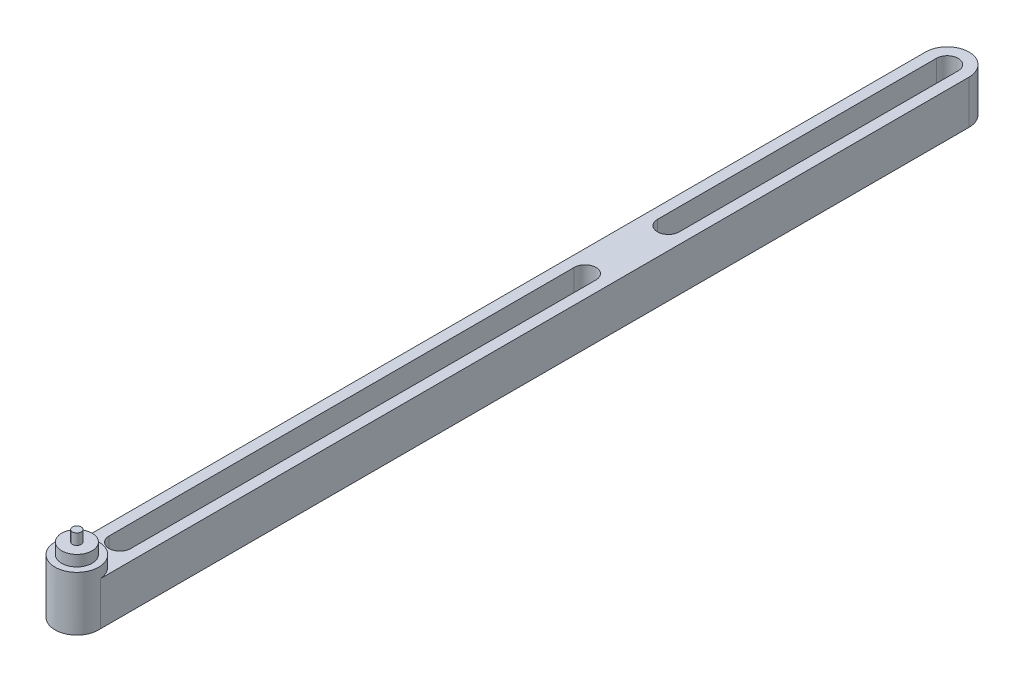
ISO-10303-21;
HEADER;
FILE_DESCRIPTION(('STEP AP214'),'2;1');
FILE_NAME('part.step','',(''),(''),'','','');
FILE_SCHEMA(('AUTOMOTIVE_DESIGN { 1 0 10303 214 1 1 1 1 }'));
ENDSEC;
DATA;
#1=APPLICATION_CONTEXT('core data for automotive mechanical design processes');
#2=APPLICATION_PROTOCOL_DEFINITION('international standard','automotive_design',2000,#1);
#3=PRODUCT_CONTEXT('',#1,'mechanical');
#4=PRODUCT('Part','Part','',(#3));
#5=PRODUCT_RELATED_PRODUCT_CATEGORY('part','',(#4));
#6=PRODUCT_DEFINITION_FORMATION('','',#4);
#7=PRODUCT_DEFINITION_CONTEXT('part definition',#1,'design');
#8=PRODUCT_DEFINITION('design','',#6,#7);
#9=PRODUCT_DEFINITION_SHAPE('','',#8);
#10=(LENGTH_UNIT() NAMED_UNIT(*) SI_UNIT(.MILLI.,.METRE.));
#11=(NAMED_UNIT(*) PLANE_ANGLE_UNIT() SI_UNIT($,.RADIAN.));
#12=(NAMED_UNIT(*) SI_UNIT($,.STERADIAN.) SOLID_ANGLE_UNIT());
#13=UNCERTAINTY_MEASURE_WITH_UNIT(LENGTH_MEASURE(1.E-05),#10,'distance_accuracy_value','');
#14=(GEOMETRIC_REPRESENTATION_CONTEXT(3) GLOBAL_UNCERTAINTY_ASSIGNED_CONTEXT((#13)) GLOBAL_UNIT_ASSIGNED_CONTEXT((#10,
#11,#12)) REPRESENTATION_CONTEXT('',''));
#15=CARTESIAN_POINT('',(0.,0.,0.));
#16=DIRECTION('',(0.,0.,1.));
#17=DIRECTION('',(1.,0.,0.));
#18=AXIS2_PLACEMENT_3D('',#15,#16,#17);
#19=CARTESIAN_POINT('',(0.,10.,143.903897259946));
#20=DIRECTION('',(0.,-1.,0.));
#21=DIRECTION('',(0.,0.,-1.));
#22=AXIS2_PLACEMENT_3D('',#19,#20,#21);
#23=CYLINDRICAL_SURFACE('',#22,2.5);
#24=CARTESIAN_POINT('',(0.,0.,143.903897259946));
#25=DIRECTION('',(0.,1.,0.));
#26=DIRECTION('',(0.,0.,1.));
#27=AXIS2_PLACEMENT_3D('',#24,#25,#26);
#28=CIRCLE('',#27,2.5);
#29=CARTESIAN_POINT('',(-2.49999999999999,0.,143.903897259946));
#30=VERTEX_POINT('',#29);
#31=CARTESIAN_POINT('',(2.50000000000001,0.,143.903897259946));
#32=VERTEX_POINT('',#31);
#33=EDGE_CURVE('E192',#30,#32,#28,.T.);
#34=ORIENTED_EDGE('',*,*,#33,.F.);
#35=DIRECTION('',(0.,-1.,0.));
#36=VECTOR('',#35,1.);
#37=CARTESIAN_POINT('',(-2.49999999999999,10.,143.903897259946));
#38=LINE('',#37,#36);
#39=CARTESIAN_POINT('',(-2.49999999999999,10.,143.903897259946));
#40=VERTEX_POINT('',#39);
#41=EDGE_CURVE('E148',#40,#30,#38,.T.);
#42=ORIENTED_EDGE('',*,*,#41,.F.);
#43=CARTESIAN_POINT('',(0.,10.,143.903897259946));
#44=DIRECTION('',(0.,1.,0.));
#45=DIRECTION('',(0.,0.,1.));
#46=AXIS2_PLACEMENT_3D('',#43,#44,#45);
#47=CIRCLE('',#46,2.5);
#48=CARTESIAN_POINT('',(2.50000000000001,10.,143.903897259946));
#49=VERTEX_POINT('',#48);
#50=EDGE_CURVE('E152',#40,#49,#47,.T.);
#51=ORIENTED_EDGE('',*,*,#50,.T.);
#52=DIRECTION('',(0.,-1.,0.));
#53=VECTOR('',#52,1.);
#54=CARTESIAN_POINT('',(2.50000000000001,10.,143.903897259946));
#55=LINE('',#54,#53);
#56=EDGE_CURVE('E106',#49,#32,#55,.T.);
#57=ORIENTED_EDGE('',*,*,#56,.T.);
#58=EDGE_LOOP('',(#34,#42,#51,#57));
#59=FACE_BOUND('',#58,.T.);
#60=ADVANCED_FACE('F41',(#59),#23,.F.);
#61=CARTESIAN_POINT('',(-2.5,10.,0.));
#62=DIRECTION('',(1.,0.,0.));
#63=DIRECTION('',(0.,0.,-1.));
#64=AXIS2_PLACEMENT_3D('',#61,#62,#63);
#65=PLANE('',#64);
#66=DIRECTION('',(0.,0.,1.));
#67=VECTOR('',#66,1.);
#68=CARTESIAN_POINT('',(-2.5,0.,0.));
#69=LINE('',#68,#67);
#70=CARTESIAN_POINT('',(-2.5,0.,37.0144054426046));
#71=VERTEX_POINT('',#70);
#72=EDGE_CURVE('E142',#71,#30,#69,.T.);
#73=ORIENTED_EDGE('',*,*,#72,.F.);
#74=DIRECTION('',(0.,-1.,0.));
#75=VECTOR('',#74,1.);
#76=CARTESIAN_POINT('',(-2.5,10.,37.0144054426046));
#77=LINE('',#76,#75);
#78=CARTESIAN_POINT('',(-2.5,10.,37.0144054426046));
#79=VERTEX_POINT('',#78);
#80=EDGE_CURVE('E137',#79,#71,#77,.T.);
#81=ORIENTED_EDGE('',*,*,#80,.F.);
#82=DIRECTION('',(0.,0.,1.));
#83=VECTOR('',#82,1.);
#84=CARTESIAN_POINT('',(-2.5,10.,0.));
#85=LINE('',#84,#83);
#86=EDGE_CURVE('E140',#79,#40,#85,.T.);
#87=ORIENTED_EDGE('',*,*,#86,.T.);
#88=ORIENTED_EDGE('',*,*,#41,.T.);
#89=EDGE_LOOP('',(#73,#81,#87,#88));
#90=FACE_BOUND('',#89,.T.);
#91=ADVANCED_FACE('F139',(#90),#65,.T.);
#92=CARTESIAN_POINT('',(0.,10.,37.0144054426046));
#93=DIRECTION('',(0.,-1.,0.));
#94=DIRECTION('',(0.,0.,-1.));
#95=AXIS2_PLACEMENT_3D('',#92,#93,#94);
#96=CYLINDRICAL_SURFACE('',#95,2.5);
#97=CARTESIAN_POINT('',(0.,0.,37.0144054426046));
#98=DIRECTION('',(0.,1.,0.));
#99=DIRECTION('',(0.,0.,1.));
#100=AXIS2_PLACEMENT_3D('',#97,#98,#99);
#101=CIRCLE('',#100,2.5);
#102=CARTESIAN_POINT('',(2.5,0.,37.0144054426046));
#103=VERTEX_POINT('',#102);
#104=EDGE_CURVE('E198',#103,#71,#101,.T.);
#105=ORIENTED_EDGE('',*,*,#104,.F.);
#106=DIRECTION('',(0.,-1.,0.));
#107=VECTOR('',#106,1.);
#108=CARTESIAN_POINT('',(2.5,10.,37.0144054426046));
#109=LINE('',#108,#107);
#110=CARTESIAN_POINT('',(2.5,10.,37.0144054426046));
#111=VERTEX_POINT('',#110);
#112=EDGE_CURVE('E99',#111,#103,#109,.T.);
#113=ORIENTED_EDGE('',*,*,#112,.F.);
#114=CARTESIAN_POINT('',(0.,10.,37.0144054426046));
#115=DIRECTION('',(0.,1.,0.));
#116=DIRECTION('',(0.,0.,1.));
#117=AXIS2_PLACEMENT_3D('',#114,#115,#116);
#118=CIRCLE('',#117,2.5);
#119=EDGE_CURVE('E151',#111,#79,#118,.T.);
#120=ORIENTED_EDGE('',*,*,#119,.T.);
#121=ORIENTED_EDGE('',*,*,#80,.T.);
#122=EDGE_LOOP('',(#105,#113,#120,#121));
#123=FACE_BOUND('',#122,.T.);
#124=ADVANCED_FACE('F155',(#123),#96,.F.);
#125=CARTESIAN_POINT('',(0.,10.,17.887410680907));
#126=DIRECTION('',(0.,-1.,0.));
#127=DIRECTION('',(0.,0.,-1.));
#128=AXIS2_PLACEMENT_3D('',#125,#126,#127);
#129=CYLINDRICAL_SURFACE('',#128,2.5);
#130=CARTESIAN_POINT('',(0.,0.,17.887410680907));
#131=DIRECTION('',(0.,1.,0.));
#132=DIRECTION('',(0.,0.,1.));
#133=AXIS2_PLACEMENT_3D('',#130,#131,#132);
#134=CIRCLE('',#133,2.5);
#135=CARTESIAN_POINT('',(-2.49999999999999,0.,17.887410680907));
#136=VERTEX_POINT('',#135);
#137=CARTESIAN_POINT('',(2.50000000000001,0.,17.887410680907));
#138=VERTEX_POINT('',#137);
#139=EDGE_CURVE('E176',#136,#138,#134,.T.);
#140=ORIENTED_EDGE('',*,*,#139,.F.);
#141=DIRECTION('',(0.,-1.,0.));
#142=VECTOR('',#141,1.);
#143=CARTESIAN_POINT('',(-2.49999999999999,10.,17.887410680907));
#144=LINE('',#143,#142);
#145=CARTESIAN_POINT('',(-2.49999999999999,10.,17.887410680907));
#146=VERTEX_POINT('',#145);
#147=EDGE_CURVE('E207',#146,#136,#144,.T.);
#148=ORIENTED_EDGE('',*,*,#147,.F.);
#149=CARTESIAN_POINT('',(0.,10.,17.887410680907));
#150=DIRECTION('',(0.,1.,0.));
#151=DIRECTION('',(0.,0.,1.));
#152=AXIS2_PLACEMENT_3D('',#149,#150,#151);
#153=CIRCLE('',#152,2.5);
#154=CARTESIAN_POINT('',(2.50000000000001,10.,17.887410680907));
#155=VERTEX_POINT('',#154);
#156=EDGE_CURVE('E272',#146,#155,#153,.T.);
#157=ORIENTED_EDGE('',*,*,#156,.T.);
#158=DIRECTION('',(0.,-1.,0.));
#159=VECTOR('',#158,1.);
#160=CARTESIAN_POINT('',(2.50000000000001,10.,17.887410680907));
#161=LINE('',#160,#159);
#162=EDGE_CURVE('E212',#155,#138,#161,.T.);
#163=ORIENTED_EDGE('',*,*,#162,.T.);
#164=EDGE_LOOP('',(#140,#148,#157,#163));
#165=FACE_BOUND('',#164,.T.);
#166=ADVANCED_FACE('F320',(#165),#129,.F.);
#167=CARTESIAN_POINT('',(-2.49999999999999,10.,0.));
#168=DIRECTION('',(1.,0.,0.));
#169=DIRECTION('',(0.,0.,-1.));
#170=AXIS2_PLACEMENT_3D('',#167,#168,#169);
#171=PLANE('',#170);
#172=DIRECTION('',(0.,0.,1.));
#173=VECTOR('',#172,1.);
#174=CARTESIAN_POINT('',(-2.49999999999999,0.,0.));
#175=LINE('',#174,#173);
#176=CARTESIAN_POINT('',(-2.5,0.,-46.2037037037037));
#177=VERTEX_POINT('',#176);
#178=EDGE_CURVE('E180',#177,#136,#175,.T.);
#179=ORIENTED_EDGE('',*,*,#178,.F.);
#180=DIRECTION('',(0.,-1.,0.));
#181=VECTOR('',#180,1.);
#182=CARTESIAN_POINT('',(-2.5,10.,-46.2037037037037));
#183=LINE('',#182,#181);
#184=CARTESIAN_POINT('',(-2.5,10.,-46.2037037037037));
#185=VERTEX_POINT('',#184);
#186=EDGE_CURVE('E218',#185,#177,#183,.T.);
#187=ORIENTED_EDGE('',*,*,#186,.F.);
#188=DIRECTION('',(0.,0.,1.));
#189=VECTOR('',#188,1.);
#190=CARTESIAN_POINT('',(-2.49999999999999,10.,0.));
#191=LINE('',#190,#189);
#192=EDGE_CURVE('E276',#185,#146,#191,.T.);
#193=ORIENTED_EDGE('',*,*,#192,.T.);
#194=ORIENTED_EDGE('',*,*,#147,.T.);
#195=EDGE_LOOP('',(#179,#187,#193,#194));
#196=FACE_BOUND('',#195,.T.);
#197=ADVANCED_FACE('F316',(#196),#171,.T.);
#198=CARTESIAN_POINT('',(0.,10.,-46.2037037037037));
#199=DIRECTION('',(0.,-1.,0.));
#200=DIRECTION('',(0.,0.,-1.));
#201=AXIS2_PLACEMENT_3D('',#198,#199,#200);
#202=CYLINDRICAL_SURFACE('',#201,2.5);
#203=CARTESIAN_POINT('',(0.,0.,-46.2037037037037));
#204=DIRECTION('',(0.,1.,0.));
#205=DIRECTION('',(0.,0.,1.));
#206=AXIS2_PLACEMENT_3D('',#203,#204,#205);
#207=CIRCLE('',#206,2.5);
#208=CARTESIAN_POINT('',(2.5,0.,-46.2037037037037));
#209=VERTEX_POINT('',#208);
#210=EDGE_CURVE('E184',#209,#177,#207,.T.);
#211=ORIENTED_EDGE('',*,*,#210,.F.);
#212=DIRECTION('',(0.,-1.,0.));
#213=VECTOR('',#212,1.);
#214=CARTESIAN_POINT('',(2.5,10.,-46.2037037037037));
#215=LINE('',#214,#213);
#216=CARTESIAN_POINT('',(2.5,10.,-46.2037037037037));
#217=VERTEX_POINT('',#216);
#218=EDGE_CURVE('E215',#217,#209,#215,.T.);
#219=ORIENTED_EDGE('',*,*,#218,.F.);
#220=CARTESIAN_POINT('',(0.,10.,-46.2037037037037));
#221=DIRECTION('',(0.,1.,0.));
#222=DIRECTION('',(0.,0.,1.));
#223=AXIS2_PLACEMENT_3D('',#220,#221,#222);
#224=CIRCLE('',#223,2.5);
#225=EDGE_CURVE('E280',#217,#185,#224,.T.);
#226=ORIENTED_EDGE('',*,*,#225,.T.);
#227=ORIENTED_EDGE('',*,*,#186,.T.);
#228=EDGE_LOOP('',(#211,#219,#226,#227));
#229=FACE_BOUND('',#228,.T.);
#230=ADVANCED_FACE('F313',(#229),#202,.F.);
#231=CARTESIAN_POINT('',(0.,10.,-46.2037037037037));
#232=DIRECTION('',(0.,-1.,0.));
#233=DIRECTION('',(0.,0.,-1.));
#234=AXIS2_PLACEMENT_3D('',#231,#232,#233);
#235=CYLINDRICAL_SURFACE('',#234,5.);
#236=CARTESIAN_POINT('',(0.,0.,-46.2037037037037));
#237=DIRECTION('',(0.,1.,0.));
#238=DIRECTION('',(0.,0.,1.));
#239=AXIS2_PLACEMENT_3D('',#236,#237,#238);
#240=CIRCLE('',#239,5.);
#241=CARTESIAN_POINT('',(-5.,0.,-46.2037037037037));
#242=VERTEX_POINT('',#241);
#243=CARTESIAN_POINT('',(5.,0.,-46.2037037037037));
#244=VERTEX_POINT('',#243);
#245=EDGE_CURVE('E163',#242,#244,#240,.F.);
#246=ORIENTED_EDGE('',*,*,#245,.F.);
#247=DIRECTION('',(0.,-1.,0.));
#248=VECTOR('',#247,1.);
#249=CARTESIAN_POINT('',(-5.,10.,-46.2037037037037));
#250=LINE('',#249,#248);
#251=CARTESIAN_POINT('',(-5.,10.,-46.2037037037037));
#252=VERTEX_POINT('',#251);
#253=EDGE_CURVE('E45',#252,#242,#250,.T.);
#254=ORIENTED_EDGE('',*,*,#253,.F.);
#255=CARTESIAN_POINT('',(0.,10.,-46.2037037037037));
#256=DIRECTION('',(0.,1.,0.));
#257=DIRECTION('',(0.,0.,1.));
#258=AXIS2_PLACEMENT_3D('',#255,#256,#257);
#259=CIRCLE('',#258,5.);
#260=CARTESIAN_POINT('',(5.,10.,-46.2037037037037));
#261=VERTEX_POINT('',#260);
#262=EDGE_CURVE('E204',#252,#261,#259,.F.);
#263=ORIENTED_EDGE('',*,*,#262,.T.);
#264=DIRECTION('',(0.,-1.,0.));
#265=VECTOR('',#264,1.);
#266=CARTESIAN_POINT('',(5.,10.,-46.2037037037037));
#267=LINE('',#266,#265);
#268=EDGE_CURVE('E159',#261,#244,#267,.T.);
#269=ORIENTED_EDGE('',*,*,#268,.T.);
#270=EDGE_LOOP('',(#246,#254,#263,#269));
#271=FACE_BOUND('',#270,.T.);
#272=ADVANCED_FACE('F43',(#271),#235,.T.);
#273=CARTESIAN_POINT('',(-5.,10.,0.));
#274=DIRECTION('',(-1.,0.,0.));
#275=DIRECTION('',(0.,0.,1.));
#276=AXIS2_PLACEMENT_3D('',#273,#274,#275);
#277=PLANE('',#276);
#278=DIRECTION('',(0.,0.,-1.));
#279=VECTOR('',#278,1.);
#280=CARTESIAN_POINT('',(-5.,0.,0.));
#281=LINE('',#280,#279);
#282=CARTESIAN_POINT('',(-5.,0.,153.415497966942));
#283=VERTEX_POINT('',#282);
#284=EDGE_CURVE('E167',#283,#242,#281,.T.);
#285=ORIENTED_EDGE('',*,*,#284,.F.);
#286=DIRECTION('',(0.,-1.,0.));
#287=VECTOR('',#286,1.);
#288=CARTESIAN_POINT('',(-5.,10.,153.415497966942));
#289=LINE('',#288,#287);
#290=CARTESIAN_POINT('',(-5.,10.,153.415497966942));
#291=VERTEX_POINT('',#290);
#292=EDGE_CURVE('E228',#291,#283,#289,.T.);
#293=ORIENTED_EDGE('',*,*,#292,.F.);
#294=DIRECTION('',(0.,0.,-1.));
#295=VECTOR('',#294,1.);
#296=CARTESIAN_POINT('',(-5.,10.,0.));
#297=LINE('',#296,#295);
#298=EDGE_CURVE('E241',#291,#252,#297,.T.);
#299=ORIENTED_EDGE('',*,*,#298,.T.);
#300=ORIENTED_EDGE('',*,*,#253,.T.);
#301=EDGE_LOOP('',(#285,#293,#299,#300));
#302=FACE_BOUND('',#301,.T.);
#303=ADVANCED_FACE('F239',(#302),#277,.T.);
#304=CARTESIAN_POINT('',(2.50000000000001,10.,0.));
#305=DIRECTION('',(1.,0.,0.));
#306=DIRECTION('',(0.,0.,-1.));
#307=AXIS2_PLACEMENT_3D('',#304,#305,#306);
#308=PLANE('',#307);
#309=DIRECTION('',(0.,0.,1.));
#310=VECTOR('',#309,1.);
#311=CARTESIAN_POINT('',(2.50000000000001,0.,0.));
#312=LINE('',#311,#310);
#313=EDGE_CURVE('E188',#209,#138,#312,.T.);
#314=ORIENTED_EDGE('',*,*,#313,.T.);
#315=ORIENTED_EDGE('',*,*,#162,.F.);
#316=DIRECTION('',(0.,0.,1.));
#317=VECTOR('',#316,1.);
#318=CARTESIAN_POINT('',(2.50000000000001,10.,0.));
#319=LINE('',#318,#317);
#320=EDGE_CURVE('E284',#217,#155,#319,.T.);
#321=ORIENTED_EDGE('',*,*,#320,.F.);
#322=ORIENTED_EDGE('',*,*,#218,.T.);
#323=EDGE_LOOP('',(#314,#315,#321,#322));
#324=FACE_BOUND('',#323,.T.);
#325=ADVANCED_FACE('F298',(#324),#308,.F.);
#326=CARTESIAN_POINT('',(5.,10.,0.));
#327=DIRECTION('',(-1.,0.,0.));
#328=DIRECTION('',(0.,0.,1.));
#329=AXIS2_PLACEMENT_3D('',#326,#327,#328);
#330=PLANE('',#329);
#331=DIRECTION('',(0.,0.,-1.));
#332=VECTOR('',#331,1.);
#333=CARTESIAN_POINT('',(5.,0.,0.));
#334=LINE('',#333,#332);
#335=CARTESIAN_POINT('',(5.,0.,153.415497966942));
#336=VERTEX_POINT('',#335);
#337=EDGE_CURVE('E172',#336,#244,#334,.T.);
#338=ORIENTED_EDGE('',*,*,#337,.T.);
#339=ORIENTED_EDGE('',*,*,#268,.F.);
#340=DIRECTION('',(0.,0.,-1.));
#341=VECTOR('',#340,1.);
#342=CARTESIAN_POINT('',(5.,10.,0.));
#343=LINE('',#342,#341);
#344=CARTESIAN_POINT('',(5.,10.,153.415497966942));
#345=VERTEX_POINT('',#344);
#346=EDGE_CURVE('E269',#345,#261,#343,.T.);
#347=ORIENTED_EDGE('',*,*,#346,.F.);
#348=DIRECTION('',(0.,-1.,0.));
#349=VECTOR('',#348,1.);
#350=CARTESIAN_POINT('',(5.,10.,153.415497966942));
#351=LINE('',#350,#349);
#352=EDGE_CURVE('E225',#345,#336,#351,.T.);
#353=ORIENTED_EDGE('',*,*,#352,.T.);
#354=EDGE_LOOP('',(#338,#339,#347,#353));
#355=FACE_BOUND('',#354,.T.);
#356=ADVANCED_FACE('F290',(#355),#330,.F.);
#357=CARTESIAN_POINT('',(2.5,10.,0.));
#358=DIRECTION('',(1.,0.,0.));
#359=DIRECTION('',(0.,0.,-1.));
#360=AXIS2_PLACEMENT_3D('',#357,#358,#359);
#361=PLANE('',#360);
#362=DIRECTION('',(0.,0.,1.));
#363=VECTOR('',#362,1.);
#364=CARTESIAN_POINT('',(2.5,0.,0.));
#365=LINE('',#364,#363);
#366=EDGE_CURVE('E201',#103,#32,#365,.T.);
#367=ORIENTED_EDGE('',*,*,#366,.T.);
#368=ORIENTED_EDGE('',*,*,#56,.F.);
#369=DIRECTION('',(0.,0.,1.));
#370=VECTOR('',#369,1.);
#371=CARTESIAN_POINT('',(2.5,10.,0.));
#372=LINE('',#371,#370);
#373=EDGE_CURVE('E61',#111,#49,#372,.T.);
#374=ORIENTED_EDGE('',*,*,#373,.F.);
#375=ORIENTED_EDGE('',*,*,#112,.T.);
#376=EDGE_LOOP('',(#367,#368,#374,#375));
#377=FACE_BOUND('',#376,.T.);
#378=ADVANCED_FACE('F288',(#377),#361,.F.);
#379=CARTESIAN_POINT('',(0.,10.,0.));
#380=DIRECTION('',(0.,1.,0.));
#381=DIRECTION('',(0.,0.,1.));
#382=AXIS2_PLACEMENT_3D('',#379,#380,#381);
#383=PLANE('',#382);
#384=ORIENTED_EDGE('',*,*,#262,.F.);
#385=ORIENTED_EDGE('',*,*,#298,.F.);
#386=CARTESIAN_POINT('',(0.,10.,153.796296296296));
#387=DIRECTION('',(0.,1.,0.));
#388=DIRECTION('',(0.,0.,1.));
#389=AXIS2_PLACEMENT_3D('',#386,#387,#388);
#390=CIRCLE('',#389,5.01447977038884);
#391=EDGE_CURVE('E266',#345,#291,#390,.T.);
#392=ORIENTED_EDGE('',*,*,#391,.F.);
#393=ORIENTED_EDGE('',*,*,#346,.T.);
#394=EDGE_LOOP('',(#384,#385,#392,#393));
#395=FACE_BOUND('',#394,.T.);
#396=ORIENTED_EDGE('',*,*,#156,.F.);
#397=ORIENTED_EDGE('',*,*,#192,.F.);
#398=ORIENTED_EDGE('',*,*,#225,.F.);
#399=ORIENTED_EDGE('',*,*,#320,.T.);
#400=EDGE_LOOP('',(#396,#397,#398,#399));
#401=FACE_BOUND('',#400,.T.);
#402=ORIENTED_EDGE('',*,*,#50,.F.);
#403=ORIENTED_EDGE('',*,*,#86,.F.);
#404=ORIENTED_EDGE('',*,*,#119,.F.);
#405=ORIENTED_EDGE('',*,*,#373,.T.);
#406=EDGE_LOOP('',(#402,#403,#404,#405));
#407=FACE_BOUND('',#406,.T.);
#408=ADVANCED_FACE('F150',(#395,#401,#407),#383,.T.);
#409=CARTESIAN_POINT('',(0.,0.,0.));
#410=DIRECTION('',(0.,1.,0.));
#411=DIRECTION('',(0.,0.,1.));
#412=AXIS2_PLACEMENT_3D('',#409,#410,#411);
#413=PLANE('',#412);
#414=ORIENTED_EDGE('',*,*,#245,.T.);
#415=ORIENTED_EDGE('',*,*,#337,.F.);
#416=CARTESIAN_POINT('',(0.,0.,153.796296296296));
#417=DIRECTION('',(0.,1.,0.));
#418=DIRECTION('',(0.,0.,1.));
#419=AXIS2_PLACEMENT_3D('',#416,#417,#418);
#420=CIRCLE('',#419,5.01447977038884);
#421=EDGE_CURVE('E247',#283,#336,#420,.T.);
#422=ORIENTED_EDGE('',*,*,#421,.F.);
#423=ORIENTED_EDGE('',*,*,#284,.T.);
#424=EDGE_LOOP('',(#414,#415,#422,#423));
#425=FACE_BOUND('',#424,.T.);
#426=ORIENTED_EDGE('',*,*,#139,.T.);
#427=ORIENTED_EDGE('',*,*,#313,.F.);
#428=ORIENTED_EDGE('',*,*,#210,.T.);
#429=ORIENTED_EDGE('',*,*,#178,.T.);
#430=EDGE_LOOP('',(#426,#427,#428,#429));
#431=FACE_BOUND('',#430,.T.);
#432=ORIENTED_EDGE('',*,*,#33,.T.);
#433=ORIENTED_EDGE('',*,*,#366,.F.);
#434=ORIENTED_EDGE('',*,*,#104,.T.);
#435=ORIENTED_EDGE('',*,*,#72,.T.);
#436=EDGE_LOOP('',(#432,#433,#434,#435));
#437=FACE_BOUND('',#436,.T.);
#438=ADVANCED_FACE('F245',(#425,#431,#437),#413,.F.);
#439=CARTESIAN_POINT('',(0.,12.5,153.796296296296));
#440=DIRECTION('',(0.,-1.,0.));
#441=DIRECTION('',(0.,0.,-1.));
#442=AXIS2_PLACEMENT_3D('',#439,#440,#441);
#443=CYLINDRICAL_SURFACE('',#442,5.01447977038884);
#444=ORIENTED_EDGE('',*,*,#292,.T.);
#445=ORIENTED_EDGE('',*,*,#421,.T.);
#446=ORIENTED_EDGE('',*,*,#352,.F.);
#447=ORIENTED_EDGE('',*,*,#391,.T.);
#448=EDGE_LOOP('',(#444,#445,#446,#447));
#449=FACE_BOUND('',#448,.T.);
#450=CARTESIAN_POINT('',(0.,12.5,153.796296296296));
#451=DIRECTION('',(0.,1.,0.));
#452=DIRECTION('',(0.,0.,1.));
#453=AXIS2_PLACEMENT_3D('',#450,#451,#452);
#454=CIRCLE('',#453,5.01447977038884);
#455=CARTESIAN_POINT('',(0.,12.5,158.810776066685));
#456=VERTEX_POINT('',#455);
#457=EDGE_CURVE('E168',#456,#456,#454,.T.);
#458=ORIENTED_EDGE('',*,*,#457,.F.);
#459=EDGE_LOOP('',(#458));
#460=FACE_BOUND('',#459,.T.);
#461=ADVANCED_FACE('F398',(#449,#460),#443,.T.);
#462=CARTESIAN_POINT('',(0.,12.5,0.));
#463=DIRECTION('',(0.,1.,0.));
#464=DIRECTION('',(0.,0.,1.));
#465=AXIS2_PLACEMENT_3D('',#462,#463,#464);
#466=PLANE('',#465);
#467=CARTESIAN_POINT('',(0.,12.5,153.796296296296));
#468=DIRECTION('',(0.,1.,0.));
#469=DIRECTION('',(0.,0.,1.));
#470=AXIS2_PLACEMENT_3D('',#467,#468,#469);
#471=CIRCLE('',#470,3.5);
#472=CARTESIAN_POINT('',(0.,12.5,157.296296296296));
#473=VERTEX_POINT('',#472);
#474=EDGE_CURVE('E52',#473,#473,#471,.T.);
#475=ORIENTED_EDGE('',*,*,#474,.F.);
#476=EDGE_LOOP('',(#475));
#477=FACE_BOUND('',#476,.T.);
#478=ORIENTED_EDGE('',*,*,#457,.T.);
#479=EDGE_LOOP('',(#478));
#480=FACE_BOUND('',#479,.T.);
#481=ADVANCED_FACE('F408',(#477,#480),#466,.T.);
#482=CARTESIAN_POINT('',(0.,15.,153.796296296296));
#483=DIRECTION('',(0.,-1.,0.));
#484=DIRECTION('',(0.,0.,-1.));
#485=AXIS2_PLACEMENT_3D('',#482,#483,#484);
#486=CYLINDRICAL_SURFACE('',#485,3.5);
#487=CARTESIAN_POINT('',(0.,15.,153.796296296296));
#488=DIRECTION('',(0.,1.,0.));
#489=DIRECTION('',(0.,0.,1.));
#490=AXIS2_PLACEMENT_3D('',#487,#488,#489);
#491=CIRCLE('',#490,3.5);
#492=CARTESIAN_POINT('',(0.,15.,157.296296296296));
#493=VERTEX_POINT('',#492);
#494=EDGE_CURVE('E251',#493,#493,#491,.T.);
#495=ORIENTED_EDGE('',*,*,#494,.F.);
#496=EDGE_LOOP('',(#495));
#497=FACE_BOUND('',#496,.T.);
#498=ORIENTED_EDGE('',*,*,#474,.T.);
#499=EDGE_LOOP('',(#498));
#500=FACE_BOUND('',#499,.T.);
#501=ADVANCED_FACE('F416',(#497,#500),#486,.T.);
#502=CARTESIAN_POINT('',(0.,15.,153.796296296296));
#503=DIRECTION('',(0.,1.,0.));
#504=DIRECTION('',(0.,0.,1.));
#505=AXIS2_PLACEMENT_3D('',#502,#503,#504);
#506=PLANE('',#505);
#507=CARTESIAN_POINT('',(0.,15.,153.796296296296));
#508=DIRECTION('',(0.,1.,0.));
#509=DIRECTION('',(0.,0.,1.));
#510=AXIS2_PLACEMENT_3D('',#507,#508,#509);
#511=CIRCLE('',#510,1.);
#512=CARTESIAN_POINT('',(0.,15.,154.796296296296));
#513=VERTEX_POINT('',#512);
#514=EDGE_CURVE('E11',#513,#513,#511,.T.);
#515=ORIENTED_EDGE('',*,*,#514,.F.);
#516=EDGE_LOOP('',(#515));
#517=FACE_BOUND('',#516,.T.);
#518=ORIENTED_EDGE('',*,*,#494,.T.);
#519=EDGE_LOOP('',(#518));
#520=FACE_BOUND('',#519,.T.);
#521=ADVANCED_FACE('F425',(#517,#520),#506,.T.);
#522=CARTESIAN_POINT('',(0.,17.5,153.796296296296));
#523=DIRECTION('',(0.,-1.,0.));
#524=DIRECTION('',(0.,0.,-1.));
#525=AXIS2_PLACEMENT_3D('',#522,#523,#524);
#526=CYLINDRICAL_SURFACE('',#525,1.);
#527=CARTESIAN_POINT('',(0.,17.5,153.796296296296));
#528=DIRECTION('',(0.,1.,0.));
#529=DIRECTION('',(0.,0.,1.));
#530=AXIS2_PLACEMENT_3D('',#527,#528,#529);
#531=CIRCLE('',#530,1.);
#532=CARTESIAN_POINT('',(0.,17.5,154.796296296296));
#533=VERTEX_POINT('',#532);
#534=EDGE_CURVE('E258',#533,#533,#531,.T.);
#535=ORIENTED_EDGE('',*,*,#534,.F.);
#536=EDGE_LOOP('',(#535));
#537=FACE_BOUND('',#536,.T.);
#538=ORIENTED_EDGE('',*,*,#514,.T.);
#539=EDGE_LOOP('',(#538));
#540=FACE_BOUND('',#539,.T.);
#541=ADVANCED_FACE('F434',(#537,#540),#526,.T.);
#542=CARTESIAN_POINT('',(0.,17.5,153.796296296296));
#543=DIRECTION('',(0.,1.,0.));
#544=DIRECTION('',(0.,0.,1.));
#545=AXIS2_PLACEMENT_3D('',#542,#543,#544);
#546=PLANE('',#545);
#547=ORIENTED_EDGE('',*,*,#534,.T.);
#548=EDGE_LOOP('',(#547));
#549=FACE_BOUND('',#548,.T.);
#550=ADVANCED_FACE('F443',(#549),#546,.T.);
#551=CLOSED_SHELL('',(#60,#91,#124,#166,#197,#230,#272,#303,#325,#356,#378,#408,#438,#461,#481,
#501,#521,#541,#550));
#552=MANIFOLD_SOLID_BREP('B2',#551);
#553=ADVANCED_BREP_SHAPE_REPRESENTATION('',(#18,#552),#14);
#554=SHAPE_DEFINITION_REPRESENTATION(#9,#553);
ENDSEC;
END-ISO-10303-21;
